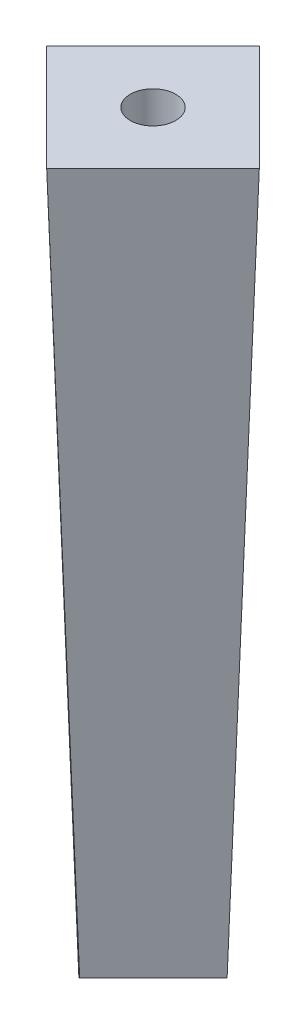
ISO-10303-21;
HEADER;
FILE_DESCRIPTION(('STEP AP214'),'2;1');
FILE_NAME('part.step','',(''),(''),'','','');
FILE_SCHEMA(('AUTOMOTIVE_DESIGN { 1 0 10303 214 1 1 1 1 }'));
ENDSEC;
DATA;
#1=APPLICATION_CONTEXT('core data for automotive mechanical design processes');
#2=APPLICATION_PROTOCOL_DEFINITION('international standard','automotive_design',2000,#1);
#3=PRODUCT_CONTEXT('',#1,'mechanical');
#4=PRODUCT('Part','Part','',(#3));
#5=PRODUCT_RELATED_PRODUCT_CATEGORY('part','',(#4));
#6=PRODUCT_DEFINITION_FORMATION('','',#4);
#7=PRODUCT_DEFINITION_CONTEXT('part definition',#1,'design');
#8=PRODUCT_DEFINITION('design','',#6,#7);
#9=PRODUCT_DEFINITION_SHAPE('','',#8);
#10=(LENGTH_UNIT() NAMED_UNIT(*) SI_UNIT(.MILLI.,.METRE.));
#11=(NAMED_UNIT(*) PLANE_ANGLE_UNIT() SI_UNIT($,.RADIAN.));
#12=(NAMED_UNIT(*) SI_UNIT($,.STERADIAN.) SOLID_ANGLE_UNIT());
#13=UNCERTAINTY_MEASURE_WITH_UNIT(LENGTH_MEASURE(1.E-05),#10,'distance_accuracy_value','');
#14=(GEOMETRIC_REPRESENTATION_CONTEXT(3) GLOBAL_UNCERTAINTY_ASSIGNED_CONTEXT((#13)) GLOBAL_UNIT_ASSIGNED_CONTEXT((#10,
#11,#12)) REPRESENTATION_CONTEXT('',''));
#15=CARTESIAN_POINT('',(0.,0.,0.));
#16=DIRECTION('',(0.,0.,1.));
#17=DIRECTION('',(1.,0.,0.));
#18=AXIS2_PLACEMENT_3D('',#15,#16,#17);
#19=CARTESIAN_POINT('',(75.9361129096519,50.1301357425981,22.225));
#20=DIRECTION('',(0.,1.,0.));
#21=DIRECTION('',(0.,0.,1.));
#22=AXIS2_PLACEMENT_3D('',#19,#20,#21);
#23=PLANE('',#22);
#24=CARTESIAN_POINT('',(91.3479975022957,50.1301357425981,0.));
#25=DIRECTION('',(0.,1.,0.));
#26=DIRECTION('',(0.,0.,1.));
#27=AXIS2_PLACEMENT_3D('',#24,#25,#26);
#28=CIRCLE('',#27,4.7625);
#29=CARTESIAN_POINT('',(91.3479975022957,50.1301357425981,4.76249999999998));
#30=VERTEX_POINT('',#29);
#31=EDGE_CURVE('E206',#30,#30,#28,.T.);
#32=ORIENTED_EDGE('',*,*,#31,.T.);
#33=EDGE_LOOP('',(#32));
#34=FACE_BOUND('',#33,.T.);
#35=DIRECTION('',(-0.70710678118655,0.,0.707106781186545));
#36=VECTOR('',#35,1.);
#37=CARTESIAN_POINT('',(64.7825552059738,50.1301357425981,11.0714422963218));
#38=LINE('',#37,#36);
#39=CARTESIAN_POINT('',(91.2658820949397,50.130135742598,-15.4118845926439));
#40=VERTEX_POINT('',#39);
#41=CARTESIAN_POINT('',(75.8539975022958,50.1301357425981,0.));
#42=VERTEX_POINT('',#41);
#43=EDGE_CURVE('E110',#40,#42,#38,.T.);
#44=ORIENTED_EDGE('',*,*,#43,.F.);
#45=DIRECTION('',(1.,0.,0.));
#46=VECTOR('',#45,1.);
#47=CARTESIAN_POINT('',(69.1229975022958,50.1301357425981,-15.4118845926439));
#48=LINE('',#47,#46);
#49=CARTESIAN_POINT('',(91.3479975022957,50.1301357425981,-15.4118845926439));
#50=VERTEX_POINT('',#49);
#51=EDGE_CURVE('E133',#40,#50,#48,.T.);
#52=ORIENTED_EDGE('',*,*,#51,.T.);
#53=DIRECTION('',(0.,0.,1.));
#54=VECTOR('',#53,1.);
#55=CARTESIAN_POINT('',(91.3479975022957,50.1301357425981,-22.225));
#56=LINE('',#55,#54);
#57=CARTESIAN_POINT('',(91.3479975022957,50.1301357425981,-15.4939999999999));
#58=VERTEX_POINT('',#57);
#59=EDGE_CURVE('E130',#58,#50,#56,.T.);
#60=ORIENTED_EDGE('',*,*,#59,.F.);
#61=DIRECTION('',(-0.707106781186547,0.,-0.707106781186548));
#62=VECTOR('',#61,1.);
#63=CARTESIAN_POINT('',(102.501555205974,50.1301357425981,-4.34044229632191));
#64=LINE('',#63,#62);
#65=CARTESIAN_POINT('',(106.75988209494,50.130135742598,-0.0821154073561066));
#66=VERTEX_POINT('',#65);
#67=EDGE_CURVE('E120',#66,#58,#64,.T.);
#68=ORIENTED_EDGE('',*,*,#67,.F.);
#69=DIRECTION('',(0.,0.,1.));
#70=VECTOR('',#69,1.);
#71=CARTESIAN_POINT('',(106.75988209494,50.1301357425981,-22.225));
#72=LINE('',#71,#70);
#73=CARTESIAN_POINT('',(106.75988209494,50.1301357425981,0.));
#74=VERTEX_POINT('',#73);
#75=EDGE_CURVE('E164',#66,#74,#72,.T.);
#76=ORIENTED_EDGE('',*,*,#75,.T.);
#77=DIRECTION('',(-1.,0.,0.));
#78=VECTOR('',#77,1.);
#79=CARTESIAN_POINT('',(113.572997502296,50.1301357425981,2.32794518267366E-13));
#80=LINE('',#79,#78);
#81=CARTESIAN_POINT('',(106.841997502296,50.1301357425981,0.));
#82=VERTEX_POINT('',#81);
#83=EDGE_CURVE('E154',#82,#74,#80,.T.);
#84=ORIENTED_EDGE('',*,*,#83,.F.);
#85=DIRECTION('',(0.707106781186555,0.,-0.70710678118654));
#86=VECTOR('',#85,1.);
#87=CARTESIAN_POINT('',(80.2765552059735,50.1301357425981,26.5654422963218));
#88=LINE('',#87,#86);
#89=CARTESIAN_POINT('',(91.4301129096517,50.1301357425981,15.4118845926439));
#90=VERTEX_POINT('',#89);
#91=EDGE_CURVE('E141',#90,#82,#88,.T.);
#92=ORIENTED_EDGE('',*,*,#91,.F.);
#93=DIRECTION('',(-1.,0.,0.));
#94=VECTOR('',#93,1.);
#95=CARTESIAN_POINT('',(113.572997502296,50.1301357425981,15.4118845926441));
#96=LINE('',#95,#94);
#97=CARTESIAN_POINT('',(91.3479975022956,50.1301357425981,15.4118845926439));
#98=VERTEX_POINT('',#97);
#99=EDGE_CURVE('E152',#90,#98,#96,.T.);
#100=ORIENTED_EDGE('',*,*,#99,.T.);
#101=DIRECTION('',(0.,0.,-1.));
#102=VECTOR('',#101,1.);
#103=CARTESIAN_POINT('',(91.3479975022957,50.1301357425981,22.225));
#104=LINE('',#103,#102);
#105=CARTESIAN_POINT('',(91.3479975022957,50.1301357425981,15.494));
#106=VERTEX_POINT('',#105);
#107=EDGE_CURVE('E42',#106,#98,#104,.T.);
#108=ORIENTED_EDGE('',*,*,#107,.F.);
#109=DIRECTION('',(0.707106781186547,0.,0.707106781186548));
#110=VECTOR('',#109,1.);
#111=CARTESIAN_POINT('',(87.0075552059738,50.1301357425981,11.1535577036781));
#112=LINE('',#111,#110);
#113=CARTESIAN_POINT('',(75.9361129096519,50.1301357425981,0.0821154073560984));
#114=VERTEX_POINT('',#113);
#115=EDGE_CURVE('E50',#114,#106,#112,.T.);
#116=ORIENTED_EDGE('',*,*,#115,.F.);
#117=DIRECTION('',(0.,0.,-1.));
#118=VECTOR('',#117,1.);
#119=CARTESIAN_POINT('',(75.9361129096519,50.1301357425981,22.225));
#120=LINE('',#119,#118);
#121=CARTESIAN_POINT('',(75.9361129096519,50.1301357425981,0.));
#122=VERTEX_POINT('',#121);
#123=EDGE_CURVE('E188',#114,#122,#120,.T.);
#124=ORIENTED_EDGE('',*,*,#123,.T.);
#125=DIRECTION('',(1.,0.,0.));
#126=VECTOR('',#125,1.);
#127=CARTESIAN_POINT('',(69.1229975022957,50.1301357425981,0.));
#128=LINE('',#127,#126);
#129=EDGE_CURVE('E36',#42,#122,#128,.T.);
#130=ORIENTED_EDGE('',*,*,#129,.F.);
#131=EDGE_LOOP('',(#44,#52,#60,#68,#76,#84,#92,#100,#108,#116,#124,#130));
#132=FACE_BOUND('',#131,.T.);
#133=ADVANCED_FACE('F33',(#34,#132),#23,.F.);
#134=CARTESIAN_POINT('',(91.3479975022957,200.018674704433,22.225));
#135=DIRECTION('',(0.,-1.,0.));
#136=DIRECTION('',(0.,0.,-1.));
#137=AXIS2_PLACEMENT_3D('',#134,#135,#136);
#138=PLANE('',#137);
#139=CARTESIAN_POINT('',(91.3479975022957,200.018674704433,0.));
#140=DIRECTION('',(0.,1.,0.));
#141=DIRECTION('',(0.,0.,1.));
#142=AXIS2_PLACEMENT_3D('',#139,#140,#141);
#143=CIRCLE('',#142,4.7625);
#144=CARTESIAN_POINT('',(91.3479975022957,200.018674704433,4.76249999999998));
#145=VERTEX_POINT('',#144);
#146=EDGE_CURVE('E233',#145,#145,#143,.T.);
#147=ORIENTED_EDGE('',*,*,#146,.F.);
#148=EDGE_LOOP('',(#147));
#149=FACE_BOUND('',#148,.T.);
#150=DIRECTION('',(0.70710678118655,0.,-0.707106781186545));
#151=VECTOR('',#150,1.);
#152=CARTESIAN_POINT('',(69.1229975022958,200.018674704433,0.));
#153=LINE('',#152,#151);
#154=CARTESIAN_POINT('',(69.1229975022957,200.018674704433,0.));
#155=VERTEX_POINT('',#154);
#156=CARTESIAN_POINT('',(91.3479975022958,200.018674704434,-22.225));
#157=VERTEX_POINT('',#156);
#158=EDGE_CURVE('E98',#155,#157,#153,.T.);
#159=ORIENTED_EDGE('',*,*,#158,.F.);
#160=DIRECTION('',(-0.707106781186547,0.,-0.707106781186548));
#161=VECTOR('',#160,1.);
#162=CARTESIAN_POINT('',(91.3479975022957,200.018674704433,22.225));
#163=LINE('',#162,#161);
#164=CARTESIAN_POINT('',(91.3479975022955,200.018674704433,22.225));
#165=VERTEX_POINT('',#164);
#166=EDGE_CURVE('E180',#165,#155,#163,.T.);
#167=ORIENTED_EDGE('',*,*,#166,.F.);
#168=DIRECTION('',(-0.707106781186555,0.,0.70710678118654));
#169=VECTOR('',#168,1.);
#170=CARTESIAN_POINT('',(91.3479975022956,200.018674704433,22.2249999999999));
#171=LINE('',#170,#169);
#172=CARTESIAN_POINT('',(113.572997502296,200.018674704431,1.13801550783976E-13));
#173=VERTEX_POINT('',#172);
#174=EDGE_CURVE('E136',#173,#165,#171,.T.);
#175=ORIENTED_EDGE('',*,*,#174,.F.);
#176=DIRECTION('',(0.707106781186547,0.,0.707106781186548));
#177=VECTOR('',#176,1.);
#178=CARTESIAN_POINT('',(113.572997502296,200.018674704433,0.));
#179=LINE('',#178,#177);
#180=EDGE_CURVE('E117',#157,#173,#179,.T.);
#181=ORIENTED_EDGE('',*,*,#180,.F.);
#182=EDGE_LOOP('',(#159,#167,#175,#181));
#183=FACE_BOUND('',#182,.T.);
#184=ADVANCED_FACE('F139',(#149,#183),#138,.F.);
#185=CARTESIAN_POINT('',(69.1229975022957,50.1301357425981,0.));
#186=DIRECTION('',(0.,0.,-1.));
#187=DIRECTION('',(-1.,0.,0.));
#188=AXIS2_PLACEMENT_3D('',#185,#186,#187);
#189=PLANE('',#188);
#190=DIRECTION('',(-0.0448614909910995,0.998993216506526,0.));
#191=VECTOR('',#190,1.);
#192=CARTESIAN_POINT('',(75.8404510055357,50.4317944274013,0.));
#193=LINE('',#192,#191);
#194=EDGE_CURVE('E105',#42,#155,#193,.T.);
#195=ORIENTED_EDGE('',*,*,#194,.F.);
#196=ORIENTED_EDGE('',*,*,#129,.T.);
#197=DIRECTION('',(0.04540766091865,-0.9989685402103,0.));
#198=VECTOR('',#197,1.);
#199=CARTESIAN_POINT('',(69.1229975022957,200.018674704433,0.));
#200=LINE('',#199,#198);
#201=EDGE_CURVE('E185',#155,#122,#200,.T.);
#202=ORIENTED_EDGE('',*,*,#201,.F.);
#203=EDGE_LOOP('',(#195,#196,#202));
#204=FACE_BOUND('',#203,.T.);
#205=ADVANCED_FACE('F227',(#204),#189,.F.);
#206=CARTESIAN_POINT('',(69.1229975022958,200.018674704433,-22.2250000000001));
#207=DIRECTION('',(0.,0.04540766091865,0.9989685402103));
#208=DIRECTION('',(0.,-0.9989685402103,0.04540766091865));
#209=AXIS2_PLACEMENT_3D('',#206,#207,#208);
#210=PLANE('',#209);
#211=DIRECTION('',(-0.000547277976681112,-0.998968390608165,0.045407654118553));
#212=VECTOR('',#211,1.);
#213=CARTESIAN_POINT('',(91.3479908456153,200.006523999127,-22.2244476952134));
#214=LINE('',#213,#212);
#215=EDGE_CURVE('E102',#157,#40,#214,.T.);
#216=ORIENTED_EDGE('',*,*,#215,.F.);
#217=DIRECTION('',(0.,-0.9989685402103,0.04540766091865));
#218=VECTOR('',#217,1.);
#219=CARTESIAN_POINT('',(91.3479975022958,200.018674704433,-22.225));
#220=LINE('',#219,#218);
#221=EDGE_CURVE('E128',#157,#50,#220,.T.);
#222=ORIENTED_EDGE('',*,*,#221,.T.);
#223=ORIENTED_EDGE('',*,*,#51,.F.);
#224=EDGE_LOOP('',(#216,#222,#223));
#225=FACE_BOUND('',#224,.T.);
#226=ADVANCED_FACE('F135',(#225),#210,.F.);
#227=CARTESIAN_POINT('',(91.3479975022957,50.1301357425981,-22.225));
#228=DIRECTION('',(1.,0.,0.));
#229=DIRECTION('',(0.,0.,-1.));
#230=AXIS2_PLACEMENT_3D('',#227,#228,#229);
#231=PLANE('',#230);
#232=DIRECTION('',(0.,-0.998993216506527,0.0448614909910995));
#233=VECTOR('',#232,1.);
#234=CARTESIAN_POINT('',(91.3479975022957,3.50038699227875,-13.4000117537184));
#235=LINE('',#234,#233);
#236=EDGE_CURVE('E114',#157,#58,#235,.T.);
#237=ORIENTED_EDGE('',*,*,#236,.T.);
#238=ORIENTED_EDGE('',*,*,#59,.T.);
#239=ORIENTED_EDGE('',*,*,#221,.F.);
#240=EDGE_LOOP('',(#237,#238,#239));
#241=FACE_BOUND('',#240,.T.);
#242=ADVANCED_FACE('F129',(#241),#231,.F.);
#243=CARTESIAN_POINT('',(113.572997502296,200.018674704433,-22.225));
#244=DIRECTION('',(-0.9989685402103,0.04540766091865,0.));
#245=DIRECTION('',(-0.04540766091865,-0.9989685402103,0.));
#246=AXIS2_PLACEMENT_3D('',#243,#244,#245);
#247=PLANE('',#246);
#248=DIRECTION('',(-0.045407654118553,-0.998968390608165,-0.000547277976680954));
#249=VECTOR('',#248,1.);
#250=CARTESIAN_POINT('',(113.572445197509,200.006523999127,-6.65668047072909E-06));
#251=LINE('',#250,#249);
#252=EDGE_CURVE('E124',#173,#66,#251,.T.);
#253=ORIENTED_EDGE('',*,*,#252,.F.);
#254=DIRECTION('',(-0.04540766091865,-0.9989685402103,0.));
#255=VECTOR('',#254,1.);
#256=CARTESIAN_POINT('',(113.572997502296,200.018674704433,0.));
#257=LINE('',#256,#255);
#258=EDGE_CURVE('E162',#173,#74,#257,.T.);
#259=ORIENTED_EDGE('',*,*,#258,.T.);
#260=ORIENTED_EDGE('',*,*,#75,.F.);
#261=EDGE_LOOP('',(#253,#259,#260));
#262=FACE_BOUND('',#261,.T.);
#263=ADVANCED_FACE('F213',(#262),#247,.F.);
#264=CARTESIAN_POINT('',(113.572997502296,50.1301357425981,2.32794518267366E-13));
#265=DIRECTION('',(0.,0.,1.));
#266=DIRECTION('',(1.,0.,0.));
#267=AXIS2_PLACEMENT_3D('',#264,#265,#266);
#268=PLANE('',#267);
#269=DIRECTION('',(-0.0448614909910998,-0.998993216506526,0.));
#270=VECTOR('',#269,1.);
#271=CARTESIAN_POINT('',(104.748009256014,3.50038699227877,0.));
#272=LINE('',#271,#270);
#273=EDGE_CURVE('E125',#173,#82,#272,.T.);
#274=ORIENTED_EDGE('',*,*,#273,.T.);
#275=ORIENTED_EDGE('',*,*,#83,.T.);
#276=ORIENTED_EDGE('',*,*,#258,.F.);
#277=EDGE_LOOP('',(#274,#275,#276));
#278=FACE_BOUND('',#277,.T.);
#279=ADVANCED_FACE('F210',(#278),#268,.F.);
#280=CARTESIAN_POINT('',(113.572997502295,200.018674704433,22.2250000000002));
#281=DIRECTION('',(0.,0.04540766091865,-0.9989685402103));
#282=DIRECTION('',(0.,0.9989685402103,0.04540766091865));
#283=AXIS2_PLACEMENT_3D('',#280,#281,#282);
#284=PLANE('',#283);
#285=DIRECTION('',(0.000547277976681432,-0.998968390608165,-0.045407654118553));
#286=VECTOR('',#285,1.);
#287=CARTESIAN_POINT('',(91.348004158976,200.006523999127,22.2244476952134));
#288=LINE('',#287,#286);
#289=EDGE_CURVE('E11',#165,#90,#288,.T.);
#290=ORIENTED_EDGE('',*,*,#289,.F.);
#291=DIRECTION('',(0.,-0.9989685402103,-0.04540766091865));
#292=VECTOR('',#291,1.);
#293=CARTESIAN_POINT('',(91.3479975022955,200.018674704433,22.225));
#294=LINE('',#293,#292);
#295=EDGE_CURVE('E149',#165,#98,#294,.T.);
#296=ORIENTED_EDGE('',*,*,#295,.T.);
#297=ORIENTED_EDGE('',*,*,#99,.F.);
#298=EDGE_LOOP('',(#290,#296,#297));
#299=FACE_BOUND('',#298,.T.);
#300=ADVANCED_FACE('F200',(#299),#284,.F.);
#301=CARTESIAN_POINT('',(91.3479975022957,50.1301357425981,22.225));
#302=DIRECTION('',(-1.,0.,0.));
#303=DIRECTION('',(0.,0.,1.));
#304=AXIS2_PLACEMENT_3D('',#301,#302,#303);
#305=PLANE('',#304);
#306=ORIENTED_EDGE('',*,*,#295,.F.);
#307=DIRECTION('',(0.,0.998993216506526,0.0448614909910995));
#308=VECTOR('',#307,1.);
#309=CARTESIAN_POINT('',(91.3479975022957,50.4317944274013,15.50754649676));
#310=LINE('',#309,#308);
#311=EDGE_CURVE('E181',#106,#165,#310,.T.);
#312=ORIENTED_EDGE('',*,*,#311,.F.);
#313=ORIENTED_EDGE('',*,*,#107,.T.);
#314=EDGE_LOOP('',(#306,#312,#313));
#315=FACE_BOUND('',#314,.T.);
#316=ADVANCED_FACE('F193',(#315),#305,.F.);
#317=CARTESIAN_POINT('',(69.1229975022957,200.018674704433,22.225));
#318=DIRECTION('',(0.9989685402103,0.04540766091865,0.));
#319=DIRECTION('',(-0.04540766091865,0.9989685402103,0.));
#320=AXIS2_PLACEMENT_3D('',#317,#318,#319);
#321=PLANE('',#320);
#322=DIRECTION('',(0.045407654118553,-0.998968390608165,0.000547277976680954));
#323=VECTOR('',#322,1.);
#324=CARTESIAN_POINT('',(69.1235498070824,200.006523999127,6.65668046725965E-06));
#325=LINE('',#324,#323);
#326=EDGE_CURVE('E55',#155,#114,#325,.T.);
#327=ORIENTED_EDGE('',*,*,#326,.F.);
#328=ORIENTED_EDGE('',*,*,#201,.T.);
#329=ORIENTED_EDGE('',*,*,#123,.F.);
#330=EDGE_LOOP('',(#327,#328,#329));
#331=FACE_BOUND('',#330,.T.);
#332=ADVANCED_FACE('F256',(#331),#321,.F.);
#333=CARTESIAN_POINT('',(39.0132509992522,1.75195644907067,-39.0132509992522));
#334=DIRECTION('',(-0.706750560558774,-0.0317378370359083,0.706750560558774));
#335=DIRECTION('',(0.707106781186547,0.,0.707106781186548));
#336=AXIS2_PLACEMENT_3D('',#333,#334,#335);
#337=PLANE('',#336);
#338=ORIENTED_EDGE('',*,*,#115,.T.);
#339=ORIENTED_EDGE('',*,*,#311,.T.);
#340=ORIENTED_EDGE('',*,*,#166,.T.);
#341=ORIENTED_EDGE('',*,*,#326,.T.);
#342=EDGE_LOOP('',(#338,#339,#340,#341));
#343=FACE_BOUND('',#342,.T.);
#344=ADVANCED_FACE('F249',(#343),#337,.T.);
#345=CARTESIAN_POINT('',(52.334746503043,1.75195644907067,52.3347465030431));
#346=DIRECTION('',(0.706750560558766,-0.0317378370359083,0.706750560558781));
#347=DIRECTION('',(0.707106781186555,0.,-0.70710678118654));
#348=AXIS2_PLACEMENT_3D('',#345,#346,#347);
#349=PLANE('',#348);
#350=ORIENTED_EDGE('',*,*,#174,.T.);
#351=ORIENTED_EDGE('',*,*,#289,.T.);
#352=ORIENTED_EDGE('',*,*,#91,.T.);
#353=ORIENTED_EDGE('',*,*,#273,.F.);
#354=EDGE_LOOP('',(#350,#351,#352,#353));
#355=FACE_BOUND('',#354,.T.);
#356=ADVANCED_FACE('F202',(#355),#349,.T.);
#357=CARTESIAN_POINT('',(143.682744005339,1.75195644907067,39.0132509992522));
#358=DIRECTION('',(0.706750560558774,-0.0317378370359083,-0.706750560558774));
#359=DIRECTION('',(-0.707106781186547,0.,-0.707106781186548));
#360=AXIS2_PLACEMENT_3D('',#357,#358,#359);
#361=PLANE('',#360);
#362=ORIENTED_EDGE('',*,*,#67,.T.);
#363=ORIENTED_EDGE('',*,*,#236,.F.);
#364=ORIENTED_EDGE('',*,*,#180,.T.);
#365=ORIENTED_EDGE('',*,*,#252,.T.);
#366=EDGE_LOOP('',(#362,#363,#364,#365));
#367=FACE_BOUND('',#366,.T.);
#368=ADVANCED_FACE('F116',(#367),#361,.T.);
#369=CARTESIAN_POINT('',(130.361248501548,1.75195644907067,-52.3347465030434));
#370=DIRECTION('',(-0.706750560558771,-0.0317378370359083,-0.706750560558776));
#371=DIRECTION('',(-0.70710678118655,0.,0.707106781186545));
#372=AXIS2_PLACEMENT_3D('',#369,#370,#371);
#373=PLANE('',#372);
#374=ORIENTED_EDGE('',*,*,#194,.T.);
#375=ORIENTED_EDGE('',*,*,#158,.T.);
#376=ORIENTED_EDGE('',*,*,#215,.T.);
#377=ORIENTED_EDGE('',*,*,#43,.T.);
#378=EDGE_LOOP('',(#374,#375,#376,#377));
#379=FACE_BOUND('',#378,.T.);
#380=ADVANCED_FACE('F100',(#379),#373,.T.);
#381=CARTESIAN_POINT('',(91.3479975022957,50.1300857425981,0.));
#382=DIRECTION('',(0.,1.,0.));
#383=DIRECTION('',(0.,0.,1.));
#384=AXIS2_PLACEMENT_3D('',#381,#382,#383);
#385=CYLINDRICAL_SURFACE('',#384,4.7625);
#386=ORIENTED_EDGE('',*,*,#146,.T.);
#387=EDGE_LOOP('',(#386));
#388=FACE_BOUND('',#387,.T.);
#389=ORIENTED_EDGE('',*,*,#31,.F.);
#390=EDGE_LOOP('',(#389));
#391=FACE_BOUND('',#390,.T.);
#392=ADVANCED_FACE('F239',(#388,#391),#385,.F.);
#393=CLOSED_SHELL('',(#133,#184,#205,#226,#242,#263,#279,#300,#316,#332,#344,#356,#368,#380,#392));
#394=MANIFOLD_SOLID_BREP('B2',#393);
#395=ADVANCED_BREP_SHAPE_REPRESENTATION('',(#18,#394),#14);
#396=SHAPE_DEFINITION_REPRESENTATION(#9,#395);
ENDSEC;
END-ISO-10303-21;
